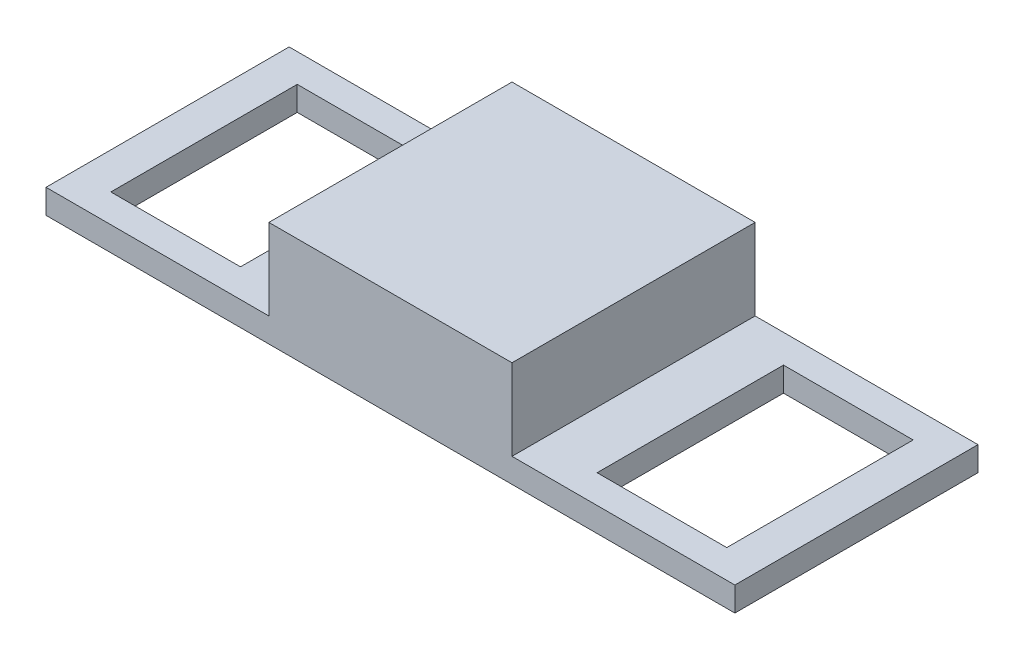
ISO-10303-21;
HEADER;
FILE_DESCRIPTION(('STEP AP214'),'2;1');
FILE_NAME('part.step','',(''),(''),'','','');
FILE_SCHEMA(('AUTOMOTIVE_DESIGN { 1 0 10303 214 1 1 1 1 }'));
ENDSEC;
DATA;
#1=APPLICATION_CONTEXT('core data for automotive mechanical design processes');
#2=APPLICATION_PROTOCOL_DEFINITION('international standard','automotive_design',2000,#1);
#3=PRODUCT_CONTEXT('',#1,'mechanical');
#4=PRODUCT('Part','Part','',(#3));
#5=PRODUCT_RELATED_PRODUCT_CATEGORY('part','',(#4));
#6=PRODUCT_DEFINITION_FORMATION('','',#4);
#7=PRODUCT_DEFINITION_CONTEXT('part definition',#1,'design');
#8=PRODUCT_DEFINITION('design','',#6,#7);
#9=PRODUCT_DEFINITION_SHAPE('','',#8);
#10=(LENGTH_UNIT() NAMED_UNIT(*) SI_UNIT(.MILLI.,.METRE.));
#11=(NAMED_UNIT(*) PLANE_ANGLE_UNIT() SI_UNIT($,.RADIAN.));
#12=(NAMED_UNIT(*) SI_UNIT($,.STERADIAN.) SOLID_ANGLE_UNIT());
#13=UNCERTAINTY_MEASURE_WITH_UNIT(LENGTH_MEASURE(1.E-05),#10,'distance_accuracy_value','');
#14=(GEOMETRIC_REPRESENTATION_CONTEXT(3) GLOBAL_UNCERTAINTY_ASSIGNED_CONTEXT((#13)) GLOBAL_UNIT_ASSIGNED_CONTEXT((#10,
#11,#12)) REPRESENTATION_CONTEXT('',''));
#15=CARTESIAN_POINT('',(0.,0.,0.));
#16=DIRECTION('',(0.,0.,1.));
#17=DIRECTION('',(1.,0.,0.));
#18=AXIS2_PLACEMENT_3D('',#15,#16,#17);
#19=CARTESIAN_POINT('',(0.,3.,0.));
#20=DIRECTION('',(0.,-1.,0.));
#21=DIRECTION('',(0.,0.,-1.));
#22=AXIS2_PLACEMENT_3D('',#19,#20,#21);
#23=PLANE('',#22);
#24=DIRECTION('',(1.,0.,0.));
#25=VECTOR('',#24,1.);
#26=CARTESIAN_POINT('',(38.,3.,11.5));
#27=LINE('',#26,#25);
#28=CARTESIAN_POINT('',(22.,3.,11.5));
#29=VERTEX_POINT('',#28);
#30=CARTESIAN_POINT('',(38.,3.,11.5));
#31=VERTEX_POINT('',#30);
#32=EDGE_CURVE('E182',#29,#31,#27,.T.);
#33=ORIENTED_EDGE('',*,*,#32,.F.);
#34=DIRECTION('',(0.,0.,1.));
#35=VECTOR('',#34,1.);
#36=CARTESIAN_POINT('',(22.,3.,11.5));
#37=LINE('',#36,#35);
#38=CARTESIAN_POINT('',(22.,3.,-11.5));
#39=VERTEX_POINT('',#38);
#40=EDGE_CURVE('E190',#39,#29,#37,.T.);
#41=ORIENTED_EDGE('',*,*,#40,.F.);
#42=DIRECTION('',(-1.,0.,0.));
#43=VECTOR('',#42,1.);
#44=CARTESIAN_POINT('',(38.,3.,-11.5));
#45=LINE('',#44,#43);
#46=CARTESIAN_POINT('',(38.,3.,-11.5));
#47=VERTEX_POINT('',#46);
#48=EDGE_CURVE('E187',#47,#39,#45,.T.);
#49=ORIENTED_EDGE('',*,*,#48,.F.);
#50=DIRECTION('',(0.,0.,-1.));
#51=VECTOR('',#50,1.);
#52=CARTESIAN_POINT('',(38.,3.,11.5));
#53=LINE('',#52,#51);
#54=EDGE_CURVE('E184',#31,#47,#53,.T.);
#55=ORIENTED_EDGE('',*,*,#54,.F.);
#56=EDGE_LOOP('',(#33,#41,#49,#55));
#57=FACE_BOUND('',#56,.T.);
#58=DIRECTION('',(0.,0.,-1.));
#59=VECTOR('',#58,1.);
#60=CARTESIAN_POINT('',(15.,3.,15.));
#61=LINE('',#60,#59);
#62=CARTESIAN_POINT('',(15.,3.,15.));
#63=VERTEX_POINT('',#62);
#64=CARTESIAN_POINT('',(15.,3.,-15.));
#65=VERTEX_POINT('',#64);
#66=EDGE_CURVE('E54',#63,#65,#61,.T.);
#67=ORIENTED_EDGE('',*,*,#66,.F.);
#68=DIRECTION('',(1.,0.,0.));
#69=VECTOR('',#68,1.);
#70=CARTESIAN_POINT('',(-42.5,3.,15.));
#71=LINE('',#70,#69);
#72=CARTESIAN_POINT('',(42.5,3.,15.));
#73=VERTEX_POINT('',#72);
#74=EDGE_CURVE('E250',#63,#73,#71,.T.);
#75=ORIENTED_EDGE('',*,*,#74,.T.);
#76=DIRECTION('',(0.,0.,-1.));
#77=VECTOR('',#76,1.);
#78=CARTESIAN_POINT('',(42.5,3.,15.));
#79=LINE('',#78,#77);
#80=CARTESIAN_POINT('',(42.5,3.,-15.));
#81=VERTEX_POINT('',#80);
#82=EDGE_CURVE('E241',#73,#81,#79,.T.);
#83=ORIENTED_EDGE('',*,*,#82,.T.);
#84=DIRECTION('',(-1.,0.,0.));
#85=VECTOR('',#84,1.);
#86=CARTESIAN_POINT('',(-42.5,3.,-15.));
#87=LINE('',#86,#85);
#88=EDGE_CURVE('E246',#81,#65,#87,.T.);
#89=ORIENTED_EDGE('',*,*,#88,.T.);
#90=EDGE_LOOP('',(#67,#75,#83,#89));
#91=FACE_BOUND('',#90,.T.);
#92=ADVANCED_FACE('F39',(#57,#91),#23,.F.);
#93=DIRECTION('',(0.,0.,-1.));
#94=VECTOR('',#93,1.);
#95=CARTESIAN_POINT('',(-22.,3.,11.5));
#96=LINE('',#95,#94);
#97=CARTESIAN_POINT('',(-22.,3.,11.5));
#98=VERTEX_POINT('',#97);
#99=CARTESIAN_POINT('',(-22.,3.,-11.5));
#100=VERTEX_POINT('',#99);
#101=EDGE_CURVE('E210',#98,#100,#96,.T.);
#102=ORIENTED_EDGE('',*,*,#101,.F.);
#103=DIRECTION('',(1.,0.,0.));
#104=VECTOR('',#103,1.);
#105=CARTESIAN_POINT('',(-38.,3.,11.5));
#106=LINE('',#105,#104);
#107=CARTESIAN_POINT('',(-38.,3.,11.5));
#108=VERTEX_POINT('',#107);
#109=EDGE_CURVE('E218',#108,#98,#106,.T.);
#110=ORIENTED_EDGE('',*,*,#109,.F.);
#111=DIRECTION('',(0.,0.,1.));
#112=VECTOR('',#111,1.);
#113=CARTESIAN_POINT('',(-38.,3.,11.5));
#114=LINE('',#113,#112);
#115=CARTESIAN_POINT('',(-38.,3.,-11.5));
#116=VERTEX_POINT('',#115);
#117=EDGE_CURVE('E215',#116,#108,#114,.T.);
#118=ORIENTED_EDGE('',*,*,#117,.F.);
#119=DIRECTION('',(-1.,0.,0.));
#120=VECTOR('',#119,1.);
#121=CARTESIAN_POINT('',(-38.,3.,-11.5));
#122=LINE('',#121,#120);
#123=EDGE_CURVE('E212',#100,#116,#122,.T.);
#124=ORIENTED_EDGE('',*,*,#123,.F.);
#125=EDGE_LOOP('',(#102,#110,#118,#124));
#126=FACE_BOUND('',#125,.T.);
#127=DIRECTION('',(0.,0.,1.));
#128=VECTOR('',#127,1.);
#129=CARTESIAN_POINT('',(-15.,3.,15.));
#130=LINE('',#129,#128);
#131=CARTESIAN_POINT('',(-15.,3.,-15.));
#132=VERTEX_POINT('',#131);
#133=CARTESIAN_POINT('',(-15.,3.,15.));
#134=VERTEX_POINT('',#133);
#135=EDGE_CURVE('E62',#132,#134,#130,.T.);
#136=ORIENTED_EDGE('',*,*,#135,.F.);
#137=CARTESIAN_POINT('',(-42.5,3.,-15.));
#138=VERTEX_POINT('',#137);
#139=EDGE_CURVE('E244',#132,#138,#87,.T.);
#140=ORIENTED_EDGE('',*,*,#139,.T.);
#141=DIRECTION('',(0.,0.,1.));
#142=VECTOR('',#141,1.);
#143=CARTESIAN_POINT('',(-42.5,3.,15.));
#144=LINE('',#143,#142);
#145=CARTESIAN_POINT('',(-42.5,3.,15.));
#146=VERTEX_POINT('',#145);
#147=EDGE_CURVE('E248',#138,#146,#144,.T.);
#148=ORIENTED_EDGE('',*,*,#147,.T.);
#149=EDGE_CURVE('E251',#146,#134,#71,.T.);
#150=ORIENTED_EDGE('',*,*,#149,.T.);
#151=EDGE_LOOP('',(#136,#140,#148,#150));
#152=FACE_BOUND('',#151,.T.);
#153=ADVANCED_FACE('F294',(#126,#152),#23,.F.);
#154=CARTESIAN_POINT('',(0.,0.,0.));
#155=DIRECTION('',(0.,-1.,0.));
#156=DIRECTION('',(0.,0.,-1.));
#157=AXIS2_PLACEMENT_3D('',#154,#155,#156);
#158=PLANE('',#157);
#159=DIRECTION('',(0.,0.,-1.));
#160=VECTOR('',#159,1.);
#161=CARTESIAN_POINT('',(42.5,0.,15.));
#162=LINE('',#161,#160);
#163=CARTESIAN_POINT('',(42.5,0.,15.));
#164=VERTEX_POINT('',#163);
#165=CARTESIAN_POINT('',(42.5,0.,-15.));
#166=VERTEX_POINT('',#165);
#167=EDGE_CURVE('E240',#164,#166,#162,.T.);
#168=ORIENTED_EDGE('',*,*,#167,.F.);
#169=DIRECTION('',(1.,0.,0.));
#170=VECTOR('',#169,1.);
#171=CARTESIAN_POINT('',(-42.5,0.,15.));
#172=LINE('',#171,#170);
#173=CARTESIAN_POINT('',(-42.5,0.,15.));
#174=VERTEX_POINT('',#173);
#175=EDGE_CURVE('E245',#174,#164,#172,.T.);
#176=ORIENTED_EDGE('',*,*,#175,.F.);
#177=DIRECTION('',(0.,0.,1.));
#178=VECTOR('',#177,1.);
#179=CARTESIAN_POINT('',(-42.5,0.,15.));
#180=LINE('',#179,#178);
#181=CARTESIAN_POINT('',(-42.5,0.,-15.));
#182=VERTEX_POINT('',#181);
#183=EDGE_CURVE('E258',#182,#174,#180,.T.);
#184=ORIENTED_EDGE('',*,*,#183,.F.);
#185=DIRECTION('',(-1.,0.,0.));
#186=VECTOR('',#185,1.);
#187=CARTESIAN_POINT('',(-42.5,0.,-15.));
#188=LINE('',#187,#186);
#189=EDGE_CURVE('E256',#166,#182,#188,.T.);
#190=ORIENTED_EDGE('',*,*,#189,.F.);
#191=EDGE_LOOP('',(#168,#176,#184,#190));
#192=FACE_BOUND('',#191,.T.);
#193=DIRECTION('',(1.,0.,0.));
#194=VECTOR('',#193,1.);
#195=CARTESIAN_POINT('',(-38.,0.,11.5));
#196=LINE('',#195,#194);
#197=CARTESIAN_POINT('',(-38.,0.,11.5));
#198=VERTEX_POINT('',#197);
#199=CARTESIAN_POINT('',(-22.,0.,11.5));
#200=VERTEX_POINT('',#199);
#201=EDGE_CURVE('E213',#198,#200,#196,.T.);
#202=ORIENTED_EDGE('',*,*,#201,.T.);
#203=DIRECTION('',(0.,0.,-1.));
#204=VECTOR('',#203,1.);
#205=CARTESIAN_POINT('',(-22.,0.,11.5));
#206=LINE('',#205,#204);
#207=CARTESIAN_POINT('',(-22.,0.,-11.5));
#208=VERTEX_POINT('',#207);
#209=EDGE_CURVE('E209',#200,#208,#206,.T.);
#210=ORIENTED_EDGE('',*,*,#209,.T.);
#211=DIRECTION('',(-1.,0.,0.));
#212=VECTOR('',#211,1.);
#213=CARTESIAN_POINT('',(-38.,0.,-11.5));
#214=LINE('',#213,#212);
#215=CARTESIAN_POINT('',(-38.,0.,-11.5));
#216=VERTEX_POINT('',#215);
#217=EDGE_CURVE('E223',#208,#216,#214,.T.);
#218=ORIENTED_EDGE('',*,*,#217,.T.);
#219=DIRECTION('',(0.,0.,1.));
#220=VECTOR('',#219,1.);
#221=CARTESIAN_POINT('',(-38.,0.,11.5));
#222=LINE('',#221,#220);
#223=EDGE_CURVE('E226',#216,#198,#222,.T.);
#224=ORIENTED_EDGE('',*,*,#223,.T.);
#225=EDGE_LOOP('',(#202,#210,#218,#224));
#226=FACE_BOUND('',#225,.T.);
#227=DIRECTION('',(0.,0.,1.));
#228=VECTOR('',#227,1.);
#229=CARTESIAN_POINT('',(22.,0.,11.5));
#230=LINE('',#229,#228);
#231=CARTESIAN_POINT('',(22.,0.,-11.5));
#232=VERTEX_POINT('',#231);
#233=CARTESIAN_POINT('',(22.,0.,11.5));
#234=VERTEX_POINT('',#233);
#235=EDGE_CURVE('E185',#232,#234,#230,.T.);
#236=ORIENTED_EDGE('',*,*,#235,.T.);
#237=DIRECTION('',(1.,0.,0.));
#238=VECTOR('',#237,1.);
#239=CARTESIAN_POINT('',(38.,0.,11.5));
#240=LINE('',#239,#238);
#241=CARTESIAN_POINT('',(38.,0.,11.5));
#242=VERTEX_POINT('',#241);
#243=EDGE_CURVE('E173',#234,#242,#240,.T.);
#244=ORIENTED_EDGE('',*,*,#243,.T.);
#245=DIRECTION('',(0.,0.,-1.));
#246=VECTOR('',#245,1.);
#247=CARTESIAN_POINT('',(38.,0.,11.5));
#248=LINE('',#247,#246);
#249=CARTESIAN_POINT('',(38.,0.,-11.5));
#250=VERTEX_POINT('',#249);
#251=EDGE_CURVE('E176',#242,#250,#248,.T.);
#252=ORIENTED_EDGE('',*,*,#251,.T.);
#253=DIRECTION('',(-1.,0.,0.));
#254=VECTOR('',#253,1.);
#255=CARTESIAN_POINT('',(38.,0.,-11.5));
#256=LINE('',#255,#254);
#257=EDGE_CURVE('E195',#250,#232,#256,.T.);
#258=ORIENTED_EDGE('',*,*,#257,.T.);
#259=EDGE_LOOP('',(#236,#244,#252,#258));
#260=FACE_BOUND('',#259,.T.);
#261=ADVANCED_FACE('F275',(#192,#226,#260),#158,.T.);
#262=CARTESIAN_POINT('',(42.5,3.,15.));
#263=DIRECTION('',(-1.,0.,0.));
#264=DIRECTION('',(0.,0.,1.));
#265=AXIS2_PLACEMENT_3D('',#262,#263,#264);
#266=PLANE('',#265);
#267=ORIENTED_EDGE('',*,*,#167,.T.);
#268=DIRECTION('',(0.,-1.,0.));
#269=VECTOR('',#268,1.);
#270=CARTESIAN_POINT('',(42.5,3.,-15.));
#271=LINE('',#270,#269);
#272=EDGE_CURVE('E11',#81,#166,#271,.T.);
#273=ORIENTED_EDGE('',*,*,#272,.F.);
#274=ORIENTED_EDGE('',*,*,#82,.F.);
#275=DIRECTION('',(0.,-1.,0.));
#276=VECTOR('',#275,1.);
#277=CARTESIAN_POINT('',(42.5,3.,15.));
#278=LINE('',#277,#276);
#279=EDGE_CURVE('E253',#73,#164,#278,.T.);
#280=ORIENTED_EDGE('',*,*,#279,.T.);
#281=EDGE_LOOP('',(#267,#273,#274,#280));
#282=FACE_BOUND('',#281,.T.);
#283=ADVANCED_FACE('F41',(#282),#266,.F.);
#284=CARTESIAN_POINT('',(-42.5,3.,-15.));
#285=DIRECTION('',(0.,0.,1.));
#286=DIRECTION('',(1.,0.,0.));
#287=AXIS2_PLACEMENT_3D('',#284,#285,#286);
#288=PLANE('',#287);
#289=ORIENTED_EDGE('',*,*,#189,.T.);
#290=DIRECTION('',(0.,-1.,0.));
#291=VECTOR('',#290,1.);
#292=CARTESIAN_POINT('',(-42.5,3.,-15.));
#293=LINE('',#292,#291);
#294=EDGE_CURVE('E47',#138,#182,#293,.T.);
#295=ORIENTED_EDGE('',*,*,#294,.F.);
#296=ORIENTED_EDGE('',*,*,#139,.F.);
#297=DIRECTION('',(0.,-1.,0.));
#298=VECTOR('',#297,1.);
#299=CARTESIAN_POINT('',(-15.,13.,-15.));
#300=LINE('',#299,#298);
#301=CARTESIAN_POINT('',(-15.,13.,-15.));
#302=VERTEX_POINT('',#301);
#303=EDGE_CURVE('E158',#302,#132,#300,.T.);
#304=ORIENTED_EDGE('',*,*,#303,.F.);
#305=DIRECTION('',(-1.,0.,0.));
#306=VECTOR('',#305,1.);
#307=CARTESIAN_POINT('',(-15.,13.,-15.));
#308=LINE('',#307,#306);
#309=CARTESIAN_POINT('',(15.,13.,-15.));
#310=VERTEX_POINT('',#309);
#311=EDGE_CURVE('E152',#310,#302,#308,.T.);
#312=ORIENTED_EDGE('',*,*,#311,.F.);
#313=DIRECTION('',(0.,-1.,0.));
#314=VECTOR('',#313,1.);
#315=CARTESIAN_POINT('',(15.,13.,-15.));
#316=LINE('',#315,#314);
#317=EDGE_CURVE('E156',#310,#65,#316,.T.);
#318=ORIENTED_EDGE('',*,*,#317,.T.);
#319=ORIENTED_EDGE('',*,*,#88,.F.);
#320=ORIENTED_EDGE('',*,*,#272,.T.);
#321=EDGE_LOOP('',(#289,#295,#296,#304,#312,#318,#319,#320));
#322=FACE_BOUND('',#321,.T.);
#323=ADVANCED_FACE('F154',(#322),#288,.F.);
#324=CARTESIAN_POINT('',(-42.5,3.,15.));
#325=DIRECTION('',(1.,0.,0.));
#326=DIRECTION('',(0.,0.,-1.));
#327=AXIS2_PLACEMENT_3D('',#324,#325,#326);
#328=PLANE('',#327);
#329=ORIENTED_EDGE('',*,*,#183,.T.);
#330=DIRECTION('',(0.,-1.,0.));
#331=VECTOR('',#330,1.);
#332=CARTESIAN_POINT('',(-42.5,3.,15.));
#333=LINE('',#332,#331);
#334=EDGE_CURVE('E263',#146,#174,#333,.T.);
#335=ORIENTED_EDGE('',*,*,#334,.F.);
#336=ORIENTED_EDGE('',*,*,#147,.F.);
#337=ORIENTED_EDGE('',*,*,#294,.T.);
#338=EDGE_LOOP('',(#329,#335,#336,#337));
#339=FACE_BOUND('',#338,.T.);
#340=ADVANCED_FACE('F270',(#339),#328,.F.);
#341=CARTESIAN_POINT('',(-42.5,3.,15.));
#342=DIRECTION('',(0.,0.,-1.));
#343=DIRECTION('',(-1.,0.,0.));
#344=AXIS2_PLACEMENT_3D('',#341,#342,#343);
#345=PLANE('',#344);
#346=ORIENTED_EDGE('',*,*,#175,.T.);
#347=ORIENTED_EDGE('',*,*,#279,.F.);
#348=ORIENTED_EDGE('',*,*,#74,.F.);
#349=DIRECTION('',(0.,-1.,0.));
#350=VECTOR('',#349,1.);
#351=CARTESIAN_POINT('',(15.,13.,15.));
#352=LINE('',#351,#350);
#353=CARTESIAN_POINT('',(15.,13.,15.));
#354=VERTEX_POINT('',#353);
#355=EDGE_CURVE('E284',#354,#63,#352,.T.);
#356=ORIENTED_EDGE('',*,*,#355,.F.);
#357=DIRECTION('',(1.,0.,0.));
#358=VECTOR('',#357,1.);
#359=CARTESIAN_POINT('',(-15.,13.,15.));
#360=LINE('',#359,#358);
#361=CARTESIAN_POINT('',(-15.,13.,15.));
#362=VERTEX_POINT('',#361);
#363=EDGE_CURVE('E167',#362,#354,#360,.T.);
#364=ORIENTED_EDGE('',*,*,#363,.F.);
#365=DIRECTION('',(0.,-1.,0.));
#366=VECTOR('',#365,1.);
#367=CARTESIAN_POINT('',(-15.,13.,15.));
#368=LINE('',#367,#366);
#369=EDGE_CURVE('E178',#362,#134,#368,.T.);
#370=ORIENTED_EDGE('',*,*,#369,.T.);
#371=ORIENTED_EDGE('',*,*,#149,.F.);
#372=ORIENTED_EDGE('',*,*,#334,.T.);
#373=EDGE_LOOP('',(#346,#347,#348,#356,#364,#370,#371,#372));
#374=FACE_BOUND('',#373,.T.);
#375=ADVANCED_FACE('F279',(#374),#345,.F.);
#376=CARTESIAN_POINT('',(-22.,3.,11.5));
#377=DIRECTION('',(-1.,0.,0.));
#378=DIRECTION('',(0.,0.,1.));
#379=AXIS2_PLACEMENT_3D('',#376,#377,#378);
#380=PLANE('',#379);
#381=ORIENTED_EDGE('',*,*,#209,.F.);
#382=DIRECTION('',(0.,-1.,0.));
#383=VECTOR('',#382,1.);
#384=CARTESIAN_POINT('',(-22.,3.,11.5));
#385=LINE('',#384,#383);
#386=EDGE_CURVE('E220',#98,#200,#385,.T.);
#387=ORIENTED_EDGE('',*,*,#386,.F.);
#388=ORIENTED_EDGE('',*,*,#101,.T.);
#389=DIRECTION('',(0.,-1.,0.));
#390=VECTOR('',#389,1.);
#391=CARTESIAN_POINT('',(-22.,3.,-11.5));
#392=LINE('',#391,#390);
#393=EDGE_CURVE('E237',#100,#208,#392,.T.);
#394=ORIENTED_EDGE('',*,*,#393,.T.);
#395=EDGE_LOOP('',(#381,#387,#388,#394));
#396=FACE_BOUND('',#395,.T.);
#397=ADVANCED_FACE('F307',(#396),#380,.T.);
#398=CARTESIAN_POINT('',(-38.,3.,-11.5));
#399=DIRECTION('',(0.,0.,1.));
#400=DIRECTION('',(1.,0.,0.));
#401=AXIS2_PLACEMENT_3D('',#398,#399,#400);
#402=PLANE('',#401);
#403=ORIENTED_EDGE('',*,*,#217,.F.);
#404=ORIENTED_EDGE('',*,*,#393,.F.);
#405=ORIENTED_EDGE('',*,*,#123,.T.);
#406=DIRECTION('',(0.,-1.,0.));
#407=VECTOR('',#406,1.);
#408=CARTESIAN_POINT('',(-38.,3.,-11.5));
#409=LINE('',#408,#407);
#410=EDGE_CURVE('E235',#116,#216,#409,.T.);
#411=ORIENTED_EDGE('',*,*,#410,.T.);
#412=EDGE_LOOP('',(#403,#404,#405,#411));
#413=FACE_BOUND('',#412,.T.);
#414=ADVANCED_FACE('F334',(#413),#402,.T.);
#415=CARTESIAN_POINT('',(-38.,3.,11.5));
#416=DIRECTION('',(1.,0.,0.));
#417=DIRECTION('',(0.,0.,-1.));
#418=AXIS2_PLACEMENT_3D('',#415,#416,#417);
#419=PLANE('',#418);
#420=ORIENTED_EDGE('',*,*,#223,.F.);
#421=ORIENTED_EDGE('',*,*,#410,.F.);
#422=ORIENTED_EDGE('',*,*,#117,.T.);
#423=DIRECTION('',(0.,-1.,0.));
#424=VECTOR('',#423,1.);
#425=CARTESIAN_POINT('',(-38.,3.,11.5));
#426=LINE('',#425,#424);
#427=EDGE_CURVE('E233',#108,#198,#426,.T.);
#428=ORIENTED_EDGE('',*,*,#427,.T.);
#429=EDGE_LOOP('',(#420,#421,#422,#428));
#430=FACE_BOUND('',#429,.T.);
#431=ADVANCED_FACE('F342',(#430),#419,.T.);
#432=CARTESIAN_POINT('',(-38.,3.,11.5));
#433=DIRECTION('',(0.,0.,-1.));
#434=DIRECTION('',(-1.,0.,0.));
#435=AXIS2_PLACEMENT_3D('',#432,#433,#434);
#436=PLANE('',#435);
#437=ORIENTED_EDGE('',*,*,#201,.F.);
#438=ORIENTED_EDGE('',*,*,#427,.F.);
#439=ORIENTED_EDGE('',*,*,#109,.T.);
#440=ORIENTED_EDGE('',*,*,#386,.T.);
#441=EDGE_LOOP('',(#437,#438,#439,#440));
#442=FACE_BOUND('',#441,.T.);
#443=ADVANCED_FACE('F350',(#442),#436,.T.);
#444=CARTESIAN_POINT('',(38.,3.,11.5));
#445=DIRECTION('',(0.,0.,-1.));
#446=DIRECTION('',(-1.,0.,0.));
#447=AXIS2_PLACEMENT_3D('',#444,#445,#446);
#448=PLANE('',#447);
#449=ORIENTED_EDGE('',*,*,#243,.F.);
#450=DIRECTION('',(0.,-1.,0.));
#451=VECTOR('',#450,1.);
#452=CARTESIAN_POINT('',(22.,3.,11.5));
#453=LINE('',#452,#451);
#454=EDGE_CURVE('E191',#29,#234,#453,.T.);
#455=ORIENTED_EDGE('',*,*,#454,.F.);
#456=ORIENTED_EDGE('',*,*,#32,.T.);
#457=DIRECTION('',(0.,-1.,0.));
#458=VECTOR('',#457,1.);
#459=CARTESIAN_POINT('',(38.,3.,11.5));
#460=LINE('',#459,#458);
#461=EDGE_CURVE('E206',#31,#242,#460,.T.);
#462=ORIENTED_EDGE('',*,*,#461,.T.);
#463=EDGE_LOOP('',(#449,#455,#456,#462));
#464=FACE_BOUND('',#463,.T.);
#465=ADVANCED_FACE('F359',(#464),#448,.T.);
#466=CARTESIAN_POINT('',(38.,3.,11.5));
#467=DIRECTION('',(-1.,0.,0.));
#468=DIRECTION('',(0.,0.,1.));
#469=AXIS2_PLACEMENT_3D('',#466,#467,#468);
#470=PLANE('',#469);
#471=ORIENTED_EDGE('',*,*,#251,.F.);
#472=ORIENTED_EDGE('',*,*,#461,.F.);
#473=ORIENTED_EDGE('',*,*,#54,.T.);
#474=DIRECTION('',(0.,-1.,0.));
#475=VECTOR('',#474,1.);
#476=CARTESIAN_POINT('',(38.,3.,-11.5));
#477=LINE('',#476,#475);
#478=EDGE_CURVE('E204',#47,#250,#477,.T.);
#479=ORIENTED_EDGE('',*,*,#478,.T.);
#480=EDGE_LOOP('',(#471,#472,#473,#479));
#481=FACE_BOUND('',#480,.T.);
#482=ADVANCED_FACE('F368',(#481),#470,.T.);
#483=CARTESIAN_POINT('',(38.,3.,-11.5));
#484=DIRECTION('',(0.,0.,1.));
#485=DIRECTION('',(1.,0.,0.));
#486=AXIS2_PLACEMENT_3D('',#483,#484,#485);
#487=PLANE('',#486);
#488=ORIENTED_EDGE('',*,*,#257,.F.);
#489=ORIENTED_EDGE('',*,*,#478,.F.);
#490=ORIENTED_EDGE('',*,*,#48,.T.);
#491=DIRECTION('',(0.,-1.,0.));
#492=VECTOR('',#491,1.);
#493=CARTESIAN_POINT('',(22.,3.,-11.5));
#494=LINE('',#493,#492);
#495=EDGE_CURVE('E202',#39,#232,#494,.T.);
#496=ORIENTED_EDGE('',*,*,#495,.T.);
#497=EDGE_LOOP('',(#488,#489,#490,#496));
#498=FACE_BOUND('',#497,.T.);
#499=ADVANCED_FACE('F377',(#498),#487,.T.);
#500=CARTESIAN_POINT('',(22.,3.,11.5));
#501=DIRECTION('',(1.,0.,0.));
#502=DIRECTION('',(0.,0.,-1.));
#503=AXIS2_PLACEMENT_3D('',#500,#501,#502);
#504=PLANE('',#503);
#505=ORIENTED_EDGE('',*,*,#235,.F.);
#506=ORIENTED_EDGE('',*,*,#495,.F.);
#507=ORIENTED_EDGE('',*,*,#40,.T.);
#508=ORIENTED_EDGE('',*,*,#454,.T.);
#509=EDGE_LOOP('',(#505,#506,#507,#508));
#510=FACE_BOUND('',#509,.T.);
#511=ADVANCED_FACE('F386',(#510),#504,.T.);
#512=CARTESIAN_POINT('',(15.,13.,15.));
#513=DIRECTION('',(-1.,0.,0.));
#514=DIRECTION('',(0.,0.,1.));
#515=AXIS2_PLACEMENT_3D('',#512,#513,#514);
#516=PLANE('',#515);
#517=ORIENTED_EDGE('',*,*,#66,.T.);
#518=ORIENTED_EDGE('',*,*,#317,.F.);
#519=DIRECTION('',(0.,0.,-1.));
#520=VECTOR('',#519,1.);
#521=CARTESIAN_POINT('',(15.,13.,15.));
#522=LINE('',#521,#520);
#523=EDGE_CURVE('E162',#354,#310,#522,.T.);
#524=ORIENTED_EDGE('',*,*,#523,.F.);
#525=ORIENTED_EDGE('',*,*,#355,.T.);
#526=EDGE_LOOP('',(#517,#518,#524,#525));
#527=FACE_BOUND('',#526,.T.);
#528=ADVANCED_FACE('F172',(#527),#516,.F.);
#529=CARTESIAN_POINT('',(-15.,13.,15.));
#530=DIRECTION('',(1.,0.,0.));
#531=DIRECTION('',(0.,0.,-1.));
#532=AXIS2_PLACEMENT_3D('',#529,#530,#531);
#533=PLANE('',#532);
#534=ORIENTED_EDGE('',*,*,#135,.T.);
#535=ORIENTED_EDGE('',*,*,#369,.F.);
#536=DIRECTION('',(0.,0.,1.));
#537=VECTOR('',#536,1.);
#538=CARTESIAN_POINT('',(-15.,13.,15.));
#539=LINE('',#538,#537);
#540=EDGE_CURVE('E161',#302,#362,#539,.T.);
#541=ORIENTED_EDGE('',*,*,#540,.F.);
#542=ORIENTED_EDGE('',*,*,#303,.T.);
#543=EDGE_LOOP('',(#534,#535,#541,#542));
#544=FACE_BOUND('',#543,.T.);
#545=ADVANCED_FACE('F293',(#544),#533,.F.);
#546=CARTESIAN_POINT('',(0.,13.,0.));
#547=DIRECTION('',(0.,-1.,0.));
#548=DIRECTION('',(0.,0.,-1.));
#549=AXIS2_PLACEMENT_3D('',#546,#547,#548);
#550=PLANE('',#549);
#551=ORIENTED_EDGE('',*,*,#523,.T.);
#552=ORIENTED_EDGE('',*,*,#311,.T.);
#553=ORIENTED_EDGE('',*,*,#540,.T.);
#554=ORIENTED_EDGE('',*,*,#363,.T.);
#555=EDGE_LOOP('',(#551,#552,#553,#554));
#556=FACE_BOUND('',#555,.T.);
#557=ADVANCED_FACE('F165',(#556),#550,.F.);
#558=CLOSED_SHELL('',(#92,#153,#261,#283,#323,#340,#375,#397,#414,#431,#443,#465,#482,#499,#511,
#528,#545,#557));
#559=MANIFOLD_SOLID_BREP('B2',#558);
#560=ADVANCED_BREP_SHAPE_REPRESENTATION('',(#18,#559),#14);
#561=SHAPE_DEFINITION_REPRESENTATION(#9,#560);
ENDSEC;
END-ISO-10303-21;
